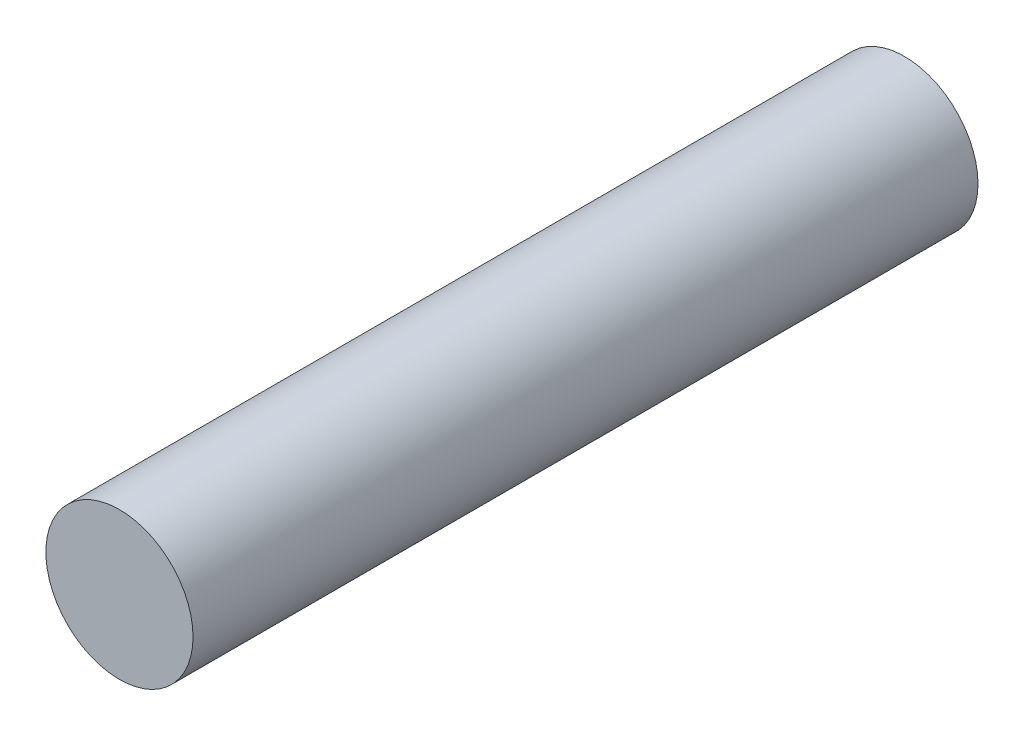
ISO-10303-21;
HEADER;
FILE_DESCRIPTION(('STEP AP214'),'2;1');
FILE_NAME('part.step','',(''),(''),'','','');
FILE_SCHEMA(('AUTOMOTIVE_DESIGN { 1 0 10303 214 1 1 1 1 }'));
ENDSEC;
DATA;
#1=APPLICATION_CONTEXT('core data for automotive mechanical design processes');
#2=APPLICATION_PROTOCOL_DEFINITION('international standard','automotive_design',2000,#1);
#3=PRODUCT_CONTEXT('',#1,'mechanical');
#4=PRODUCT('Part','Part','',(#3));
#5=PRODUCT_RELATED_PRODUCT_CATEGORY('part','',(#4));
#6=PRODUCT_DEFINITION_FORMATION('','',#4);
#7=PRODUCT_DEFINITION_CONTEXT('part definition',#1,'design');
#8=PRODUCT_DEFINITION('design','',#6,#7);
#9=PRODUCT_DEFINITION_SHAPE('','',#8);
#10=(LENGTH_UNIT() NAMED_UNIT(*) SI_UNIT(.MILLI.,.METRE.));
#11=(NAMED_UNIT(*) PLANE_ANGLE_UNIT() SI_UNIT($,.RADIAN.));
#12=(NAMED_UNIT(*) SI_UNIT($,.STERADIAN.) SOLID_ANGLE_UNIT());
#13=UNCERTAINTY_MEASURE_WITH_UNIT(LENGTH_MEASURE(1.E-05),#10,'distance_accuracy_value','');
#14=(GEOMETRIC_REPRESENTATION_CONTEXT(3) GLOBAL_UNCERTAINTY_ASSIGNED_CONTEXT((#13)) GLOBAL_UNIT_ASSIGNED_CONTEXT((#10,
#11,#12)) REPRESENTATION_CONTEXT('',''));
#15=CARTESIAN_POINT('',(0.,0.,0.));
#16=DIRECTION('',(0.,0.,1.));
#17=DIRECTION('',(1.,0.,0.));
#18=AXIS2_PLACEMENT_3D('',#15,#16,#17);
#19=CARTESIAN_POINT('',(0.,0.,24.));
#20=DIRECTION('',(0.,0.,-1.));
#21=DIRECTION('',(-1.,0.,0.));
#22=AXIS2_PLACEMENT_3D('',#19,#20,#21);
#23=CYLINDRICAL_SURFACE('',#22,2.25);
#24=CARTESIAN_POINT('',(0.,0.,24.));
#25=DIRECTION('',(0.,0.,1.));
#26=DIRECTION('',(1.,0.,0.));
#27=AXIS2_PLACEMENT_3D('',#24,#25,#26);
#28=CIRCLE('',#27,2.25);
#29=CARTESIAN_POINT('',(2.25,0.,24.));
#30=VERTEX_POINT('',#29);
#31=EDGE_CURVE('E10',#30,#30,#28,.T.);
#32=ORIENTED_EDGE('',*,*,#31,.F.);
#33=EDGE_LOOP('',(#32));
#34=FACE_BOUND('',#33,.T.);
#35=CARTESIAN_POINT('',(0.,0.,0.));
#36=DIRECTION('',(0.,0.,1.));
#37=DIRECTION('',(1.,0.,0.));
#38=AXIS2_PLACEMENT_3D('',#35,#36,#37);
#39=CIRCLE('',#38,2.25);
#40=CARTESIAN_POINT('',(2.25,0.,0.));
#41=VERTEX_POINT('',#40);
#42=EDGE_CURVE('E44',#41,#41,#39,.T.);
#43=ORIENTED_EDGE('',*,*,#42,.T.);
#44=EDGE_LOOP('',(#43));
#45=FACE_BOUND('',#44,.T.);
#46=ADVANCED_FACE('F41',(#34,#45),#23,.T.);
#47=CARTESIAN_POINT('',(0.,0.,24.));
#48=DIRECTION('',(0.,0.,1.));
#49=DIRECTION('',(1.,0.,0.));
#50=AXIS2_PLACEMENT_3D('',#47,#48,#49);
#51=PLANE('',#50);
#52=ORIENTED_EDGE('',*,*,#31,.T.);
#53=EDGE_LOOP('',(#52));
#54=FACE_BOUND('',#53,.T.);
#55=ADVANCED_FACE('F56',(#54),#51,.T.);
#56=CARTESIAN_POINT('',(0.,0.,0.));
#57=DIRECTION('',(0.,0.,1.));
#58=DIRECTION('',(1.,0.,0.));
#59=AXIS2_PLACEMENT_3D('',#56,#57,#58);
#60=PLANE('',#59);
#61=ORIENTED_EDGE('',*,*,#42,.F.);
#62=EDGE_LOOP('',(#61));
#63=FACE_BOUND('',#62,.T.);
#64=ADVANCED_FACE('F54',(#63),#60,.F.);
#65=CLOSED_SHELL('',(#46,#55,#64));
#66=MANIFOLD_SOLID_BREP('B2',#65);
#67=ADVANCED_BREP_SHAPE_REPRESENTATION('',(#18,#66),#14);
#68=SHAPE_DEFINITION_REPRESENTATION(#9,#67);
ENDSEC;
END-ISO-10303-21;
